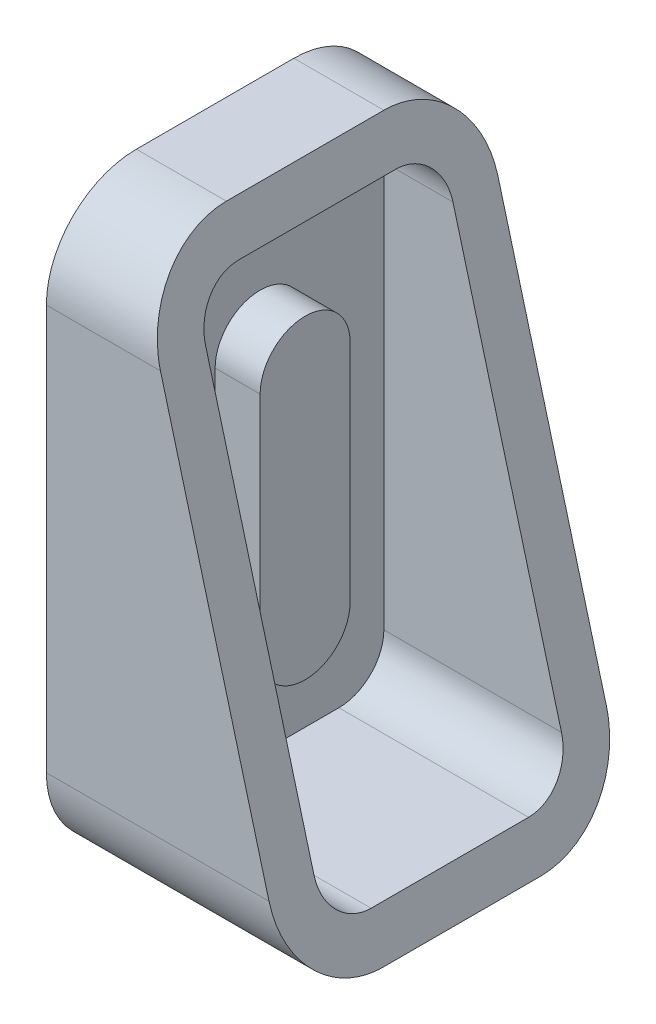
ISO-10303-21;
HEADER;
FILE_DESCRIPTION(('STEP AP214'),'2;1');
FILE_NAME('part.step','',(''),(''),'','','');
FILE_SCHEMA(('AUTOMOTIVE_DESIGN { 1 0 10303 214 1 1 1 1 }'));
ENDSEC;
DATA;
#1=APPLICATION_CONTEXT('core data for automotive mechanical design processes');
#2=APPLICATION_PROTOCOL_DEFINITION('international standard','automotive_design',2000,#1);
#3=PRODUCT_CONTEXT('',#1,'mechanical');
#4=PRODUCT('Part','Part','',(#3));
#5=PRODUCT_RELATED_PRODUCT_CATEGORY('part','',(#4));
#6=PRODUCT_DEFINITION_FORMATION('','',#4);
#7=PRODUCT_DEFINITION_CONTEXT('part definition',#1,'design');
#8=PRODUCT_DEFINITION('design','',#6,#7);
#9=PRODUCT_DEFINITION_SHAPE('','',#8);
#10=(LENGTH_UNIT() NAMED_UNIT(*) SI_UNIT(.MILLI.,.METRE.));
#11=(NAMED_UNIT(*) PLANE_ANGLE_UNIT() SI_UNIT($,.RADIAN.));
#12=(NAMED_UNIT(*) SI_UNIT($,.STERADIAN.) SOLID_ANGLE_UNIT());
#13=UNCERTAINTY_MEASURE_WITH_UNIT(LENGTH_MEASURE(1.E-05),#10,'distance_accuracy_value','');
#14=(GEOMETRIC_REPRESENTATION_CONTEXT(3) GLOBAL_UNCERTAINTY_ASSIGNED_CONTEXT((#13)) GLOBAL_UNIT_ASSIGNED_CONTEXT((#10,
#11,#12)) REPRESENTATION_CONTEXT('',''));
#15=CARTESIAN_POINT('',(0.,0.,0.));
#16=DIRECTION('',(0.,0.,1.));
#17=DIRECTION('',(1.,0.,0.));
#18=AXIS2_PLACEMENT_3D('',#15,#16,#17);
#19=CARTESIAN_POINT('',(10.,65.,37.5));
#20=DIRECTION('',(0.,0.,-1.));
#21=DIRECTION('',(0.,1.,0.));
#22=AXIS2_PLACEMENT_3D('',#19,#20,#21);
#23=PLANE('',#22);
#24=DIRECTION('',(0.,-1.,0.));
#25=VECTOR('',#24,1.);
#26=CARTESIAN_POINT('',(-10.,65.,37.5));
#27=LINE('',#26,#25);
#28=CARTESIAN_POINT('',(-10.,45.,37.5));
#29=VERTEX_POINT('',#28);
#30=CARTESIAN_POINT('',(-10.,-45.,37.5));
#31=VERTEX_POINT('',#30);
#32=EDGE_CURVE('E642',#29,#31,#27,.T.);
#33=ORIENTED_EDGE('',*,*,#32,.T.);
#34=DIRECTION('',(-1.,0.,0.));
#35=VECTOR('',#34,1.);
#36=CARTESIAN_POINT('',(10.,-45.,37.5));
#37=LINE('',#36,#35);
#38=CARTESIAN_POINT('',(39.4744111674236,-45.,37.5));
#39=VERTEX_POINT('',#38);
#40=EDGE_CURVE('E675',#31,#39,#37,.F.);
#41=ORIENTED_EDGE('',*,*,#40,.T.);
#42=DIRECTION('',(-0.258819045102521,0.965925826289068,0.));
#43=VECTOR('',#42,1.);
#44=CARTESIAN_POINT('',(10.,65.,37.5));
#45=LINE('',#44,#43);
#46=CARTESIAN_POINT('',(15.3589838486225,45.,37.5));
#47=VERTEX_POINT('',#46);
#48=EDGE_CURVE('E660',#47,#39,#45,.F.);
#49=ORIENTED_EDGE('',*,*,#48,.F.);
#50=DIRECTION('',(-1.,0.,0.));
#51=VECTOR('',#50,1.);
#52=CARTESIAN_POINT('',(10.,45.,37.5));
#53=LINE('',#52,#51);
#54=EDGE_CURVE('E672',#47,#29,#53,.T.);
#55=ORIENTED_EDGE('',*,*,#54,.T.);
#56=EDGE_LOOP('',(#33,#41,#49,#55));
#57=FACE_BOUND('',#56,.T.);
#58=ADVANCED_FACE('F419',(#57),#23,.F.);
#59=CARTESIAN_POINT('',(10.,-65.,-37.5));
#60=DIRECTION('',(0.,1.,0.));
#61=DIRECTION('',(0.,0.,1.));
#62=AXIS2_PLACEMENT_3D('',#59,#60,#61);
#63=PLANE('',#62);
#64=DIRECTION('',(0.,0.,1.));
#65=VECTOR('',#64,1.);
#66=CARTESIAN_POINT('',(44.833395016046,-65.,-37.5));
#67=LINE('',#66,#65);
#68=CARTESIAN_POINT('',(44.833395016046,-65.,17.5));
#69=VERTEX_POINT('',#68);
#70=CARTESIAN_POINT('',(44.833395016046,-65.,-17.5));
#71=VERTEX_POINT('',#70);
#72=EDGE_CURVE('E713',#69,#71,#67,.F.);
#73=ORIENTED_EDGE('',*,*,#72,.F.);
#74=DIRECTION('',(-1.,0.,0.));
#75=VECTOR('',#74,1.);
#76=CARTESIAN_POINT('',(10.,-65.,17.5));
#77=LINE('',#76,#75);
#78=CARTESIAN_POINT('',(-10.,-65.,17.5));
#79=VERTEX_POINT('',#78);
#80=EDGE_CURVE('E662',#69,#79,#77,.T.);
#81=ORIENTED_EDGE('',*,*,#80,.T.);
#82=DIRECTION('',(0.,0.,-1.));
#83=VECTOR('',#82,1.);
#84=CARTESIAN_POINT('',(-10.,-65.,-37.5));
#85=LINE('',#84,#83);
#86=CARTESIAN_POINT('',(-10.,-65.,-17.5));
#87=VERTEX_POINT('',#86);
#88=EDGE_CURVE('E652',#79,#87,#85,.T.);
#89=ORIENTED_EDGE('',*,*,#88,.T.);
#90=DIRECTION('',(-1.,0.,0.));
#91=VECTOR('',#90,1.);
#92=CARTESIAN_POINT('',(10.,-65.,-17.5));
#93=LINE('',#92,#91);
#94=EDGE_CURVE('E648',#87,#71,#93,.F.);
#95=ORIENTED_EDGE('',*,*,#94,.T.);
#96=EDGE_LOOP('',(#73,#81,#89,#95));
#97=FACE_BOUND('',#96,.T.);
#98=ADVANCED_FACE('F751',(#97),#63,.F.);
#99=CARTESIAN_POINT('',(10.,65.,-37.5));
#100=DIRECTION('',(0.,0.,1.));
#101=DIRECTION('',(0.,-1.,0.));
#102=AXIS2_PLACEMENT_3D('',#99,#100,#101);
#103=PLANE('',#102);
#104=DIRECTION('',(0.258819045102521,-0.965925826289068,0.));
#105=VECTOR('',#104,1.);
#106=CARTESIAN_POINT('',(10.,65.,-37.5));
#107=LINE('',#106,#105);
#108=CARTESIAN_POINT('',(39.4744111674236,-45.,-37.5));
#109=VERTEX_POINT('',#108);
#110=CARTESIAN_POINT('',(15.3589838486225,45.,-37.5));
#111=VERTEX_POINT('',#110);
#112=EDGE_CURVE('E649',#109,#111,#107,.F.);
#113=ORIENTED_EDGE('',*,*,#112,.F.);
#114=DIRECTION('',(-1.,0.,0.));
#115=VECTOR('',#114,1.);
#116=CARTESIAN_POINT('',(10.,-45.,-37.5));
#117=LINE('',#116,#115);
#118=CARTESIAN_POINT('',(-10.,-45.,-37.5));
#119=VERTEX_POINT('',#118);
#120=EDGE_CURVE('E681',#109,#119,#117,.T.);
#121=ORIENTED_EDGE('',*,*,#120,.T.);
#122=DIRECTION('',(0.,1.,0.));
#123=VECTOR('',#122,1.);
#124=CARTESIAN_POINT('',(-10.,65.,-37.5));
#125=LINE('',#124,#123);
#126=CARTESIAN_POINT('',(-10.,45.,-37.5));
#127=VERTEX_POINT('',#126);
#128=EDGE_CURVE('E654',#119,#127,#125,.T.);
#129=ORIENTED_EDGE('',*,*,#128,.T.);
#130=DIRECTION('',(-1.,0.,0.));
#131=VECTOR('',#130,1.);
#132=CARTESIAN_POINT('',(10.,45.,-37.5));
#133=LINE('',#132,#131);
#134=EDGE_CURVE('E679',#127,#111,#133,.F.);
#135=ORIENTED_EDGE('',*,*,#134,.T.);
#136=EDGE_LOOP('',(#113,#121,#129,#135));
#137=FACE_BOUND('',#136,.T.);
#138=ADVANCED_FACE('F729',(#137),#103,.F.);
#139=CARTESIAN_POINT('',(10.,65.,-37.5));
#140=DIRECTION('',(0.,-1.,0.));
#141=DIRECTION('',(0.,0.,-1.));
#142=AXIS2_PLACEMENT_3D('',#139,#140,#141);
#143=PLANE('',#142);
#144=DIRECTION('',(0.,0.,1.));
#145=VECTOR('',#144,1.);
#146=CARTESIAN_POINT('',(10.,65.,-37.5));
#147=LINE('',#146,#145);
#148=CARTESIAN_POINT('',(10.,65.,-17.5));
#149=VERTEX_POINT('',#148);
#150=CARTESIAN_POINT('',(10.,65.,17.5));
#151=VERTEX_POINT('',#150);
#152=EDGE_CURVE('E645',#149,#151,#147,.T.);
#153=ORIENTED_EDGE('',*,*,#152,.F.);
#154=DIRECTION('',(-1.,0.,0.));
#155=VECTOR('',#154,1.);
#156=CARTESIAN_POINT('',(10.,65.,-17.5));
#157=LINE('',#156,#155);
#158=CARTESIAN_POINT('',(-10.,65.,-17.5));
#159=VERTEX_POINT('',#158);
#160=EDGE_CURVE('E13',#149,#159,#157,.T.);
#161=ORIENTED_EDGE('',*,*,#160,.T.);
#162=DIRECTION('',(0.,0.,1.));
#163=VECTOR('',#162,1.);
#164=CARTESIAN_POINT('',(-10.,65.,-37.5));
#165=LINE('',#164,#163);
#166=CARTESIAN_POINT('',(-10.,65.,17.5));
#167=VERTEX_POINT('',#166);
#168=EDGE_CURVE('E657',#159,#167,#165,.T.);
#169=ORIENTED_EDGE('',*,*,#168,.T.);
#170=DIRECTION('',(-1.,0.,0.));
#171=VECTOR('',#170,1.);
#172=CARTESIAN_POINT('',(10.,65.,17.5));
#173=LINE('',#172,#171);
#174=EDGE_CURVE('E429',#167,#151,#173,.F.);
#175=ORIENTED_EDGE('',*,*,#174,.T.);
#176=EDGE_LOOP('',(#153,#161,#169,#175));
#177=FACE_BOUND('',#176,.T.);
#178=ADVANCED_FACE('F739',(#177),#143,.F.);
#179=CARTESIAN_POINT('',(10.,65.,-37.5));
#180=DIRECTION('',(0.965925826289068,0.258819045102521,0.));
#181=DIRECTION('',(-0.258819045102521,0.965925826289068,0.));
#182=AXIS2_PLACEMENT_3D('',#179,#180,#181);
#183=PLANE('',#182);
#184=DIRECTION('',(0.,0.,-1.));
#185=VECTOR('',#184,1.);
#186=CARTESIAN_POINT('',(42.1539030917348,-55.,17.5));
#187=LINE('',#186,#185);
#188=CARTESIAN_POINT('',(42.1539030917348,-55.,17.5));
#189=VERTEX_POINT('',#188);
#190=CARTESIAN_POINT('',(42.1539030917348,-55.,-17.5));
#191=VERTEX_POINT('',#190);
#192=EDGE_CURVE('E685',#189,#191,#187,.T.);
#193=ORIENTED_EDGE('',*,*,#192,.F.);
#194=CARTESIAN_POINT('',(39.4744111674236,-45.,17.5));
#195=DIRECTION('',(0.965925826289068,0.258819045102521,0.));
#196=DIRECTION('',(0.258819045102521,-0.965925826289068,0.));
#197=AXIS2_PLACEMENT_3D('',#194,#195,#196);
#198=ELLIPSE('',#197,10.3527618041008,10.);
#199=CARTESIAN_POINT('',(39.4744111674236,-45.,27.5));
#200=VERTEX_POINT('',#199);
#201=EDGE_CURVE('E690',#200,#189,#198,.T.);
#202=ORIENTED_EDGE('',*,*,#201,.F.);
#203=DIRECTION('',(0.258819045102521,-0.965925826289068,0.));
#204=VECTOR('',#203,1.);
#205=CARTESIAN_POINT('',(15.,46.3397459621556,27.5));
#206=LINE('',#205,#204);
#207=CARTESIAN_POINT('',(15.3589838486225,45.,27.5));
#208=VERTEX_POINT('',#207);
#209=EDGE_CURVE('E705',#208,#200,#206,.T.);
#210=ORIENTED_EDGE('',*,*,#209,.F.);
#211=CARTESIAN_POINT('',(15.3589838486225,45.,17.5));
#212=DIRECTION('',(0.965925826289068,0.258819045102521,0.));
#213=DIRECTION('',(0.258819045102521,-0.965925826289068,0.));
#214=AXIS2_PLACEMENT_3D('',#211,#212,#213);
#215=ELLIPSE('',#214,10.3527618041008,10.);
#216=CARTESIAN_POINT('',(12.6794919243112,55.,17.5));
#217=VERTEX_POINT('',#216);
#218=EDGE_CURVE('E438',#217,#208,#215,.T.);
#219=ORIENTED_EDGE('',*,*,#218,.F.);
#220=DIRECTION('',(0.,0.,1.));
#221=VECTOR('',#220,1.);
#222=CARTESIAN_POINT('',(12.6794919243112,55.,-17.5));
#223=LINE('',#222,#221);
#224=CARTESIAN_POINT('',(12.6794919243112,55.,-17.5));
#225=VERTEX_POINT('',#224);
#226=EDGE_CURVE('E644',#225,#217,#223,.T.);
#227=ORIENTED_EDGE('',*,*,#226,.F.);
#228=CARTESIAN_POINT('',(15.3589838486225,45.,-17.5));
#229=DIRECTION('',(0.965925826289068,0.258819045102521,0.));
#230=DIRECTION('',(0.258819045102521,-0.965925826289068,0.));
#231=AXIS2_PLACEMENT_3D('',#228,#229,#230);
#232=ELLIPSE('',#231,10.3527618041008,10.);
#233=CARTESIAN_POINT('',(15.3589838486225,45.,-27.5));
#234=VERTEX_POINT('',#233);
#235=EDGE_CURVE('E698',#234,#225,#232,.T.);
#236=ORIENTED_EDGE('',*,*,#235,.F.);
#237=DIRECTION('',(-0.258819045102521,0.965925826289068,0.));
#238=VECTOR('',#237,1.);
#239=CARTESIAN_POINT('',(37.5000000000001,-37.6313972081441,-27.5));
#240=LINE('',#239,#238);
#241=CARTESIAN_POINT('',(39.4744111674236,-45.,-27.5));
#242=VERTEX_POINT('',#241);
#243=EDGE_CURVE('E694',#242,#234,#240,.T.);
#244=ORIENTED_EDGE('',*,*,#243,.F.);
#245=CARTESIAN_POINT('',(39.4744111674236,-45.,-17.5));
#246=DIRECTION('',(0.965925826289068,0.258819045102521,0.));
#247=DIRECTION('',(0.258819045102521,-0.965925826289068,0.));
#248=AXIS2_PLACEMENT_3D('',#245,#246,#247);
#249=ELLIPSE('',#248,10.3527618041008,10.);
#250=EDGE_CURVE('E689',#191,#242,#249,.T.);
#251=ORIENTED_EDGE('',*,*,#250,.F.);
#252=EDGE_LOOP('',(#193,#202,#210,#219,#227,#236,#244,#251));
#253=FACE_BOUND('',#252,.T.);
#254=ORIENTED_EDGE('',*,*,#48,.T.);
#255=CARTESIAN_POINT('',(39.4744111674236,-45.,17.5));
#256=DIRECTION('',(0.965925826289068,0.258819045102521,0.));
#257=DIRECTION('',(-0.258819045102521,0.965925826289068,0.));
#258=AXIS2_PLACEMENT_3D('',#255,#256,#257);
#259=ELLIPSE('',#258,20.7055236082017,20.);
#260=EDGE_CURVE('E423',#39,#69,#259,.T.);
#261=ORIENTED_EDGE('',*,*,#260,.T.);
#262=ORIENTED_EDGE('',*,*,#72,.T.);
#263=CARTESIAN_POINT('',(39.4744111674236,-45.,-17.5));
#264=DIRECTION('',(0.965925826289068,0.258819045102521,0.));
#265=DIRECTION('',(-0.258819045102521,0.965925826289068,0.));
#266=AXIS2_PLACEMENT_3D('',#263,#264,#265);
#267=ELLIPSE('',#266,20.7055236082017,20.);
#268=EDGE_CURVE('E717',#71,#109,#267,.T.);
#269=ORIENTED_EDGE('',*,*,#268,.T.);
#270=ORIENTED_EDGE('',*,*,#112,.T.);
#271=CARTESIAN_POINT('',(15.3589838486225,45.,-17.5));
#272=DIRECTION('',(0.965925826289068,0.258819045102521,0.));
#273=DIRECTION('',(-0.258819045102521,0.965925826289068,0.));
#274=AXIS2_PLACEMENT_3D('',#271,#272,#273);
#275=ELLIPSE('',#274,20.7055236082017,20.);
#276=EDGE_CURVE('E715',#111,#149,#275,.T.);
#277=ORIENTED_EDGE('',*,*,#276,.T.);
#278=ORIENTED_EDGE('',*,*,#152,.T.);
#279=CARTESIAN_POINT('',(15.3589838486225,45.,17.5));
#280=DIRECTION('',(0.965925826289068,0.258819045102521,0.));
#281=DIRECTION('',(-0.258819045102521,0.965925826289068,0.));
#282=AXIS2_PLACEMENT_3D('',#279,#280,#281);
#283=ELLIPSE('',#282,20.7055236082017,20.);
#284=EDGE_CURVE('E678',#151,#47,#283,.T.);
#285=ORIENTED_EDGE('',*,*,#284,.T.);
#286=EDGE_LOOP('',(#254,#261,#262,#269,#270,#277,#278,#285));
#287=FACE_BOUND('',#286,.T.);
#288=ADVANCED_FACE('F421',(#253,#287),#183,.T.);
#289=CARTESIAN_POINT('',(-10.,0.,0.));
#290=DIRECTION('',(-1.,0.,0.));
#291=DIRECTION('',(0.,0.,1.));
#292=AXIS2_PLACEMENT_3D('',#289,#290,#291);
#293=PLANE('',#292);
#294=ORIENTED_EDGE('',*,*,#88,.F.);
#295=CARTESIAN_POINT('',(-10.,-45.,17.5));
#296=DIRECTION('',(-1.,0.,0.));
#297=DIRECTION('',(0.,0.,1.));
#298=AXIS2_PLACEMENT_3D('',#295,#296,#297);
#299=CIRCLE('',#298,20.);
#300=EDGE_CURVE('E670',#79,#31,#299,.T.);
#301=ORIENTED_EDGE('',*,*,#300,.T.);
#302=ORIENTED_EDGE('',*,*,#32,.F.);
#303=CARTESIAN_POINT('',(-10.,45.,17.5));
#304=DIRECTION('',(-1.,0.,0.));
#305=DIRECTION('',(0.,0.,1.));
#306=AXIS2_PLACEMENT_3D('',#303,#304,#305);
#307=CIRCLE('',#306,20.);
#308=EDGE_CURVE('E665',#29,#167,#307,.T.);
#309=ORIENTED_EDGE('',*,*,#308,.T.);
#310=ORIENTED_EDGE('',*,*,#168,.F.);
#311=CARTESIAN_POINT('',(-10.,45.,-17.5));
#312=DIRECTION('',(-1.,0.,0.));
#313=DIRECTION('',(0.,0.,1.));
#314=AXIS2_PLACEMENT_3D('',#311,#312,#313);
#315=CIRCLE('',#314,20.);
#316=EDGE_CURVE('E667',#159,#127,#315,.T.);
#317=ORIENTED_EDGE('',*,*,#316,.T.);
#318=ORIENTED_EDGE('',*,*,#128,.F.);
#319=CARTESIAN_POINT('',(-10.,-45.,-17.5));
#320=DIRECTION('',(-1.,0.,0.));
#321=DIRECTION('',(0.,0.,1.));
#322=AXIS2_PLACEMENT_3D('',#319,#320,#321);
#323=CIRCLE('',#322,20.);
#324=EDGE_CURVE('E484',#119,#87,#323,.T.);
#325=ORIENTED_EDGE('',*,*,#324,.T.);
#326=EDGE_LOOP('',(#294,#301,#302,#309,#310,#317,#318,#325));
#327=FACE_BOUND('',#326,.T.);
#328=ADVANCED_FACE('F731',(#327),#293,.T.);
#329=CARTESIAN_POINT('',(10.,-45.,17.5));
#330=DIRECTION('',(-1.,0.,0.));
#331=DIRECTION('',(0.,0.,1.));
#332=AXIS2_PLACEMENT_3D('',#329,#330,#331);
#333=CYLINDRICAL_SURFACE('',#332,20.);
#334=ORIENTED_EDGE('',*,*,#260,.F.);
#335=ORIENTED_EDGE('',*,*,#40,.F.);
#336=ORIENTED_EDGE('',*,*,#300,.F.);
#337=ORIENTED_EDGE('',*,*,#80,.F.);
#338=EDGE_LOOP('',(#334,#335,#336,#337));
#339=FACE_BOUND('',#338,.T.);
#340=ADVANCED_FACE('F750',(#339),#333,.T.);
#341=CARTESIAN_POINT('',(10.,-45.,-17.5));
#342=DIRECTION('',(-1.,0.,0.));
#343=DIRECTION('',(0.,0.,1.));
#344=AXIS2_PLACEMENT_3D('',#341,#342,#343);
#345=CYLINDRICAL_SURFACE('',#344,20.);
#346=ORIENTED_EDGE('',*,*,#268,.F.);
#347=ORIENTED_EDGE('',*,*,#94,.F.);
#348=ORIENTED_EDGE('',*,*,#324,.F.);
#349=ORIENTED_EDGE('',*,*,#120,.F.);
#350=EDGE_LOOP('',(#346,#347,#348,#349));
#351=FACE_BOUND('',#350,.T.);
#352=ADVANCED_FACE('F727',(#351),#345,.T.);
#353=CARTESIAN_POINT('',(10.,45.,-17.5));
#354=DIRECTION('',(-1.,0.,0.));
#355=DIRECTION('',(0.,0.,1.));
#356=AXIS2_PLACEMENT_3D('',#353,#354,#355);
#357=CYLINDRICAL_SURFACE('',#356,20.);
#358=ORIENTED_EDGE('',*,*,#276,.F.);
#359=ORIENTED_EDGE('',*,*,#134,.F.);
#360=ORIENTED_EDGE('',*,*,#316,.F.);
#361=ORIENTED_EDGE('',*,*,#160,.F.);
#362=EDGE_LOOP('',(#358,#359,#360,#361));
#363=FACE_BOUND('',#362,.T.);
#364=ADVANCED_FACE('F736',(#363),#357,.T.);
#365=CARTESIAN_POINT('',(10.,45.,17.5));
#366=DIRECTION('',(-1.,0.,0.));
#367=DIRECTION('',(0.,0.,1.));
#368=AXIS2_PLACEMENT_3D('',#365,#366,#367);
#369=CYLINDRICAL_SURFACE('',#368,20.);
#370=ORIENTED_EDGE('',*,*,#284,.F.);
#371=ORIENTED_EDGE('',*,*,#174,.F.);
#372=ORIENTED_EDGE('',*,*,#308,.F.);
#373=ORIENTED_EDGE('',*,*,#54,.F.);
#374=EDGE_LOOP('',(#370,#371,#372,#373));
#375=FACE_BOUND('',#374,.T.);
#376=ADVANCED_FACE('F745',(#375),#369,.T.);
#377=CARTESIAN_POINT('',(10.,-45.,17.5));
#378=DIRECTION('',(1.,0.,0.));
#379=DIRECTION('',(0.,0.,-1.));
#380=AXIS2_PLACEMENT_3D('',#377,#378,#379);
#381=CYLINDRICAL_SURFACE('',#380,10.);
#382=DIRECTION('',(1.,0.,0.));
#383=VECTOR('',#382,1.);
#384=CARTESIAN_POINT('',(10.,-45.,27.5));
#385=LINE('',#384,#383);
#386=CARTESIAN_POINT('',(0.,-45.,27.5));
#387=VERTEX_POINT('',#386);
#388=EDGE_CURVE('E640',#387,#200,#385,.T.);
#389=ORIENTED_EDGE('',*,*,#388,.T.);
#390=ORIENTED_EDGE('',*,*,#201,.T.);
#391=DIRECTION('',(1.,0.,0.));
#392=VECTOR('',#391,1.);
#393=CARTESIAN_POINT('',(10.,-55.,17.5));
#394=LINE('',#393,#392);
#395=CARTESIAN_POINT('',(0.,-55.,17.5));
#396=VERTEX_POINT('',#395);
#397=EDGE_CURVE('E638',#396,#189,#394,.T.);
#398=ORIENTED_EDGE('',*,*,#397,.F.);
#399=CARTESIAN_POINT('',(0.,-45.,17.5));
#400=DIRECTION('',(1.,0.,0.));
#401=DIRECTION('',(0.,0.,-1.));
#402=AXIS2_PLACEMENT_3D('',#399,#400,#401);
#403=CIRCLE('',#402,10.);
#404=EDGE_CURVE('E622',#387,#396,#403,.T.);
#405=ORIENTED_EDGE('',*,*,#404,.F.);
#406=EDGE_LOOP('',(#389,#390,#398,#405));
#407=FACE_BOUND('',#406,.T.);
#408=ADVANCED_FACE('F768',(#407),#381,.F.);
#409=CARTESIAN_POINT('',(10.,-55.,17.5));
#410=DIRECTION('',(0.,1.,0.));
#411=DIRECTION('',(0.,0.,-1.));
#412=AXIS2_PLACEMENT_3D('',#409,#410,#411);
#413=PLANE('',#412);
#414=ORIENTED_EDGE('',*,*,#397,.T.);
#415=ORIENTED_EDGE('',*,*,#192,.T.);
#416=DIRECTION('',(1.,0.,0.));
#417=VECTOR('',#416,1.);
#418=CARTESIAN_POINT('',(10.,-55.,-17.5));
#419=LINE('',#418,#417);
#420=CARTESIAN_POINT('',(0.,-55.,-17.5));
#421=VERTEX_POINT('',#420);
#422=EDGE_CURVE('E636',#421,#191,#419,.T.);
#423=ORIENTED_EDGE('',*,*,#422,.F.);
#424=DIRECTION('',(0.,0.,1.));
#425=VECTOR('',#424,1.);
#426=CARTESIAN_POINT('',(0.,-55.,0.));
#427=LINE('',#426,#425);
#428=EDGE_CURVE('E618',#396,#421,#427,.F.);
#429=ORIENTED_EDGE('',*,*,#428,.F.);
#430=EDGE_LOOP('',(#414,#415,#423,#429));
#431=FACE_BOUND('',#430,.T.);
#432=ADVANCED_FACE('F772',(#431),#413,.T.);
#433=CARTESIAN_POINT('',(10.,-45.,-17.5));
#434=DIRECTION('',(1.,0.,0.));
#435=DIRECTION('',(0.,0.,-1.));
#436=AXIS2_PLACEMENT_3D('',#433,#434,#435);
#437=CYLINDRICAL_SURFACE('',#436,10.);
#438=ORIENTED_EDGE('',*,*,#422,.T.);
#439=ORIENTED_EDGE('',*,*,#250,.T.);
#440=DIRECTION('',(1.,0.,0.));
#441=VECTOR('',#440,1.);
#442=CARTESIAN_POINT('',(10.,-45.,-27.5));
#443=LINE('',#442,#441);
#444=CARTESIAN_POINT('',(0.,-45.,-27.5));
#445=VERTEX_POINT('',#444);
#446=EDGE_CURVE('E634',#445,#242,#443,.T.);
#447=ORIENTED_EDGE('',*,*,#446,.F.);
#448=CARTESIAN_POINT('',(0.,-45.,-17.5));
#449=DIRECTION('',(1.,0.,0.));
#450=DIRECTION('',(0.,0.,-1.));
#451=AXIS2_PLACEMENT_3D('',#448,#449,#450);
#452=CIRCLE('',#451,10.);
#453=EDGE_CURVE('E614',#421,#445,#452,.T.);
#454=ORIENTED_EDGE('',*,*,#453,.F.);
#455=EDGE_LOOP('',(#438,#439,#447,#454));
#456=FACE_BOUND('',#455,.T.);
#457=ADVANCED_FACE('F778',(#456),#437,.F.);
#458=CARTESIAN_POINT('',(10.,-45.,-27.5));
#459=DIRECTION('',(0.,0.,1.));
#460=DIRECTION('',(0.,1.,0.));
#461=AXIS2_PLACEMENT_3D('',#458,#459,#460);
#462=PLANE('',#461);
#463=ORIENTED_EDGE('',*,*,#446,.T.);
#464=ORIENTED_EDGE('',*,*,#243,.T.);
#465=DIRECTION('',(1.,0.,0.));
#466=VECTOR('',#465,1.);
#467=CARTESIAN_POINT('',(10.,45.,-27.5));
#468=LINE('',#467,#466);
#469=CARTESIAN_POINT('',(0.,45.,-27.5));
#470=VERTEX_POINT('',#469);
#471=EDGE_CURVE('E632',#470,#234,#468,.T.);
#472=ORIENTED_EDGE('',*,*,#471,.F.);
#473=DIRECTION('',(0.,1.,0.));
#474=VECTOR('',#473,1.);
#475=CARTESIAN_POINT('',(0.,0.,-27.5));
#476=LINE('',#475,#474);
#477=EDGE_CURVE('E610',#445,#470,#476,.T.);
#478=ORIENTED_EDGE('',*,*,#477,.F.);
#479=EDGE_LOOP('',(#463,#464,#472,#478));
#480=FACE_BOUND('',#479,.T.);
#481=ADVANCED_FACE('F901',(#480),#462,.T.);
#482=CARTESIAN_POINT('',(10.,45.,-17.5));
#483=DIRECTION('',(1.,0.,0.));
#484=DIRECTION('',(0.,0.,-1.));
#485=AXIS2_PLACEMENT_3D('',#482,#483,#484);
#486=CYLINDRICAL_SURFACE('',#485,10.);
#487=ORIENTED_EDGE('',*,*,#471,.T.);
#488=ORIENTED_EDGE('',*,*,#235,.T.);
#489=DIRECTION('',(1.,0.,0.));
#490=VECTOR('',#489,1.);
#491=CARTESIAN_POINT('',(10.,55.,-17.5));
#492=LINE('',#491,#490);
#493=CARTESIAN_POINT('',(0.,55.,-17.5));
#494=VERTEX_POINT('',#493);
#495=EDGE_CURVE('E524',#494,#225,#492,.T.);
#496=ORIENTED_EDGE('',*,*,#495,.F.);
#497=CARTESIAN_POINT('',(0.,45.,-17.5));
#498=DIRECTION('',(1.,0.,0.));
#499=DIRECTION('',(0.,0.,-1.));
#500=AXIS2_PLACEMENT_3D('',#497,#498,#499);
#501=CIRCLE('',#500,10.);
#502=EDGE_CURVE('E606',#470,#494,#501,.T.);
#503=ORIENTED_EDGE('',*,*,#502,.F.);
#504=EDGE_LOOP('',(#487,#488,#496,#503));
#505=FACE_BOUND('',#504,.T.);
#506=ADVANCED_FACE('F823',(#505),#486,.F.);
#507=CARTESIAN_POINT('',(10.,55.,-17.5));
#508=DIRECTION('',(0.,-1.,0.));
#509=DIRECTION('',(0.,0.,1.));
#510=AXIS2_PLACEMENT_3D('',#507,#508,#509);
#511=PLANE('',#510);
#512=ORIENTED_EDGE('',*,*,#495,.T.);
#513=ORIENTED_EDGE('',*,*,#226,.T.);
#514=DIRECTION('',(1.,0.,0.));
#515=VECTOR('',#514,1.);
#516=CARTESIAN_POINT('',(10.,55.,17.5));
#517=LINE('',#516,#515);
#518=CARTESIAN_POINT('',(0.,55.,17.5));
#519=VERTEX_POINT('',#518);
#520=EDGE_CURVE('E629',#519,#217,#517,.T.);
#521=ORIENTED_EDGE('',*,*,#520,.F.);
#522=DIRECTION('',(0.,0.,1.));
#523=VECTOR('',#522,1.);
#524=CARTESIAN_POINT('',(0.,55.,0.));
#525=LINE('',#524,#523);
#526=EDGE_CURVE('E602',#494,#519,#525,.T.);
#527=ORIENTED_EDGE('',*,*,#526,.F.);
#528=EDGE_LOOP('',(#512,#513,#521,#527));
#529=FACE_BOUND('',#528,.T.);
#530=ADVANCED_FACE('F813',(#529),#511,.T.);
#531=CARTESIAN_POINT('',(10.,45.,17.5));
#532=DIRECTION('',(1.,0.,0.));
#533=DIRECTION('',(0.,0.,-1.));
#534=AXIS2_PLACEMENT_3D('',#531,#532,#533);
#535=CYLINDRICAL_SURFACE('',#534,10.);
#536=ORIENTED_EDGE('',*,*,#520,.T.);
#537=ORIENTED_EDGE('',*,*,#218,.T.);
#538=DIRECTION('',(1.,0.,0.));
#539=VECTOR('',#538,1.);
#540=CARTESIAN_POINT('',(10.,45.,27.5));
#541=LINE('',#540,#539);
#542=CARTESIAN_POINT('',(0.,45.,27.5));
#543=VERTEX_POINT('',#542);
#544=EDGE_CURVE('E529',#543,#208,#541,.T.);
#545=ORIENTED_EDGE('',*,*,#544,.F.);
#546=CARTESIAN_POINT('',(0.,45.,17.5));
#547=DIRECTION('',(1.,0.,0.));
#548=DIRECTION('',(0.,0.,-1.));
#549=AXIS2_PLACEMENT_3D('',#546,#547,#548);
#550=CIRCLE('',#549,10.);
#551=EDGE_CURVE('E596',#519,#543,#550,.T.);
#552=ORIENTED_EDGE('',*,*,#551,.F.);
#553=EDGE_LOOP('',(#536,#537,#545,#552));
#554=FACE_BOUND('',#553,.T.);
#555=ADVANCED_FACE('F787',(#554),#535,.F.);
#556=CARTESIAN_POINT('',(10.,45.,27.5));
#557=DIRECTION('',(0.,0.,-1.));
#558=DIRECTION('',(0.,-1.,0.));
#559=AXIS2_PLACEMENT_3D('',#556,#557,#558);
#560=PLANE('',#559);
#561=DIRECTION('',(0.,1.,0.));
#562=VECTOR('',#561,1.);
#563=CARTESIAN_POINT('',(0.,0.,27.5));
#564=LINE('',#563,#562);
#565=EDGE_CURVE('E601',#543,#387,#564,.F.);
#566=ORIENTED_EDGE('',*,*,#565,.F.);
#567=ORIENTED_EDGE('',*,*,#544,.T.);
#568=ORIENTED_EDGE('',*,*,#209,.T.);
#569=ORIENTED_EDGE('',*,*,#388,.F.);
#570=EDGE_LOOP('',(#566,#567,#568,#569));
#571=FACE_BOUND('',#570,.T.);
#572=ADVANCED_FACE('F783',(#571),#560,.T.);
#573=CARTESIAN_POINT('',(0.,0.,0.));
#574=DIRECTION('',(-1.,0.,0.));
#575=DIRECTION('',(0.,0.,1.));
#576=AXIS2_PLACEMENT_3D('',#573,#574,#575);
#577=PLANE('',#576);
#578=CARTESIAN_POINT('',(0.,-25.8717132087389,0.));
#579=DIRECTION('',(1.,0.,0.));
#580=DIRECTION('',(0.,0.,-1.));
#581=AXIS2_PLACEMENT_3D('',#578,#579,#580);
#582=CIRCLE('',#581,10.);
#583=CARTESIAN_POINT('',(0.,-25.8717132087389,9.99999999999999));
#584=VERTEX_POINT('',#583);
#585=CARTESIAN_POINT('',(0.,-25.8717132087389,-10.));
#586=VERTEX_POINT('',#585);
#587=EDGE_CURVE('E579',#584,#586,#582,.T.);
#588=ORIENTED_EDGE('',*,*,#587,.F.);
#589=DIRECTION('',(0.,1.,0.));
#590=VECTOR('',#589,1.);
#591=CARTESIAN_POINT('',(0.,0.,10.));
#592=LINE('',#591,#590);
#593=CARTESIAN_POINT('',(0.,24.1282867912611,10.));
#594=VERTEX_POINT('',#593);
#595=EDGE_CURVE('E584',#594,#584,#592,.F.);
#596=ORIENTED_EDGE('',*,*,#595,.F.);
#597=CARTESIAN_POINT('',(0.,24.1282867912611,0.));
#598=DIRECTION('',(1.,0.,0.));
#599=DIRECTION('',(0.,0.,-1.));
#600=AXIS2_PLACEMENT_3D('',#597,#598,#599);
#601=CIRCLE('',#600,10.);
#602=CARTESIAN_POINT('',(0.,24.1282867912611,-10.));
#603=VERTEX_POINT('',#602);
#604=EDGE_CURVE('E552',#603,#594,#601,.T.);
#605=ORIENTED_EDGE('',*,*,#604,.F.);
#606=DIRECTION('',(0.,1.,0.));
#607=VECTOR('',#606,1.);
#608=CARTESIAN_POINT('',(0.,0.,-10.));
#609=LINE('',#608,#607);
#610=EDGE_CURVE('E573',#586,#603,#609,.T.);
#611=ORIENTED_EDGE('',*,*,#610,.F.);
#612=EDGE_LOOP('',(#588,#596,#605,#611));
#613=FACE_BOUND('',#612,.T.);
#614=ORIENTED_EDGE('',*,*,#551,.T.);
#615=ORIENTED_EDGE('',*,*,#565,.T.);
#616=ORIENTED_EDGE('',*,*,#404,.T.);
#617=ORIENTED_EDGE('',*,*,#428,.T.);
#618=ORIENTED_EDGE('',*,*,#453,.T.);
#619=ORIENTED_EDGE('',*,*,#477,.T.);
#620=ORIENTED_EDGE('',*,*,#502,.T.);
#621=ORIENTED_EDGE('',*,*,#526,.T.);
#622=EDGE_LOOP('',(#614,#615,#616,#617,#618,#619,#620,#621));
#623=FACE_BOUND('',#622,.T.);
#624=ADVANCED_FACE('F786',(#613,#623),#577,.F.);
#625=CARTESIAN_POINT('',(10.,-25.8717132087389,0.));
#626=DIRECTION('',(1.,0.,0.));
#627=DIRECTION('',(0.,0.,-1.));
#628=AXIS2_PLACEMENT_3D('',#625,#626,#627);
#629=CYLINDRICAL_SURFACE('',#628,10.);
#630=DIRECTION('',(1.,0.,0.));
#631=VECTOR('',#630,1.);
#632=CARTESIAN_POINT('',(10.,-25.8717132087389,10.));
#633=LINE('',#632,#631);
#634=CARTESIAN_POINT('',(10.,-25.8717132087389,9.99999999999999));
#635=VERTEX_POINT('',#634);
#636=EDGE_CURVE('E564',#584,#635,#633,.T.);
#637=ORIENTED_EDGE('',*,*,#636,.F.);
#638=ORIENTED_EDGE('',*,*,#587,.T.);
#639=DIRECTION('',(1.,0.,0.));
#640=VECTOR('',#639,1.);
#641=CARTESIAN_POINT('',(10.,-25.8717132087389,-10.));
#642=LINE('',#641,#640);
#643=CARTESIAN_POINT('',(10.,-25.8717132087389,-10.));
#644=VERTEX_POINT('',#643);
#645=EDGE_CURVE('E593',#586,#644,#642,.T.);
#646=ORIENTED_EDGE('',*,*,#645,.T.);
#647=CARTESIAN_POINT('',(10.,-25.8717132087389,0.));
#648=DIRECTION('',(1.,0.,0.));
#649=DIRECTION('',(0.,0.,1.));
#650=AXIS2_PLACEMENT_3D('',#647,#648,#649);
#651=CIRCLE('',#650,10.);
#652=EDGE_CURVE('E568',#635,#644,#651,.T.);
#653=ORIENTED_EDGE('',*,*,#652,.F.);
#654=EDGE_LOOP('',(#637,#638,#646,#653));
#655=FACE_BOUND('',#654,.T.);
#656=ADVANCED_FACE('F841',(#655),#629,.T.);
#657=CARTESIAN_POINT('',(10.,24.1282867912611,-10.));
#658=DIRECTION('',(0.,0.,1.));
#659=DIRECTION('',(0.,1.,0.));
#660=AXIS2_PLACEMENT_3D('',#657,#658,#659);
#661=PLANE('',#660);
#662=ORIENTED_EDGE('',*,*,#645,.F.);
#663=ORIENTED_EDGE('',*,*,#610,.T.);
#664=DIRECTION('',(1.,0.,0.));
#665=VECTOR('',#664,1.);
#666=CARTESIAN_POINT('',(10.,24.1282867912611,-10.));
#667=LINE('',#666,#665);
#668=CARTESIAN_POINT('',(10.,24.1282867912611,-10.));
#669=VERTEX_POINT('',#668);
#670=EDGE_CURVE('E556',#603,#669,#667,.T.);
#671=ORIENTED_EDGE('',*,*,#670,.T.);
#672=DIRECTION('',(0.,1.,0.));
#673=VECTOR('',#672,1.);
#674=CARTESIAN_POINT('',(10.,24.1282867912611,-10.));
#675=LINE('',#674,#673);
#676=EDGE_CURVE('E557',#644,#669,#675,.T.);
#677=ORIENTED_EDGE('',*,*,#676,.F.);
#678=EDGE_LOOP('',(#662,#663,#671,#677));
#679=FACE_BOUND('',#678,.T.);
#680=ADVANCED_FACE('F844',(#679),#661,.F.);
#681=CARTESIAN_POINT('',(10.,24.1282867912611,0.));
#682=DIRECTION('',(1.,0.,0.));
#683=DIRECTION('',(0.,0.,-1.));
#684=AXIS2_PLACEMENT_3D('',#681,#682,#683);
#685=CYLINDRICAL_SURFACE('',#684,10.);
#686=ORIENTED_EDGE('',*,*,#670,.F.);
#687=ORIENTED_EDGE('',*,*,#604,.T.);
#688=DIRECTION('',(1.,0.,0.));
#689=VECTOR('',#688,1.);
#690=CARTESIAN_POINT('',(10.,24.1282867912611,10.));
#691=LINE('',#690,#689);
#692=CARTESIAN_POINT('',(10.,24.1282867912611,10.));
#693=VERTEX_POINT('',#692);
#694=EDGE_CURVE('E542',#594,#693,#691,.T.);
#695=ORIENTED_EDGE('',*,*,#694,.T.);
#696=CARTESIAN_POINT('',(10.,24.1282867912611,0.));
#697=DIRECTION('',(1.,0.,0.));
#698=DIRECTION('',(0.,0.,1.));
#699=AXIS2_PLACEMENT_3D('',#696,#697,#698);
#700=CIRCLE('',#699,10.);
#701=EDGE_CURVE('E548',#669,#693,#700,.T.);
#702=ORIENTED_EDGE('',*,*,#701,.F.);
#703=EDGE_LOOP('',(#686,#687,#695,#702));
#704=FACE_BOUND('',#703,.T.);
#705=ADVANCED_FACE('F545',(#704),#685,.T.);
#706=CARTESIAN_POINT('',(10.,24.1282867912611,10.));
#707=DIRECTION('',(0.,0.,-1.));
#708=DIRECTION('',(0.,-1.,0.));
#709=AXIS2_PLACEMENT_3D('',#706,#707,#708);
#710=PLANE('',#709);
#711=ORIENTED_EDGE('',*,*,#595,.T.);
#712=ORIENTED_EDGE('',*,*,#636,.T.);
#713=DIRECTION('',(0.,-1.,0.));
#714=VECTOR('',#713,1.);
#715=CARTESIAN_POINT('',(10.,24.1282867912611,10.));
#716=LINE('',#715,#714);
#717=EDGE_CURVE('E561',#693,#635,#716,.T.);
#718=ORIENTED_EDGE('',*,*,#717,.F.);
#719=ORIENTED_EDGE('',*,*,#694,.F.);
#720=EDGE_LOOP('',(#711,#712,#718,#719));
#721=FACE_BOUND('',#720,.T.);
#722=ADVANCED_FACE('F562',(#721),#710,.F.);
#723=CARTESIAN_POINT('',(10.,0.,0.));
#724=DIRECTION('',(-1.,0.,0.));
#725=DIRECTION('',(0.,0.,1.));
#726=AXIS2_PLACEMENT_3D('',#723,#724,#725);
#727=PLANE('',#726);
#728=ORIENTED_EDGE('',*,*,#652,.T.);
#729=ORIENTED_EDGE('',*,*,#676,.T.);
#730=ORIENTED_EDGE('',*,*,#701,.T.);
#731=ORIENTED_EDGE('',*,*,#717,.T.);
#732=EDGE_LOOP('',(#728,#729,#730,#731));
#733=FACE_BOUND('',#732,.T.);
#734=ADVANCED_FACE('F570',(#733),#727,.F.);
#735=CLOSED_SHELL('',(#58,#98,#138,#178,#288,#328,#340,#352,#364,#376,#408,#432,#457,#481,#506,
#530,#555,#572,#624,#656,#680,#705,#722,#734));
#736=MANIFOLD_SOLID_BREP('B2',#735);
#737=ADVANCED_BREP_SHAPE_REPRESENTATION('',(#18,#736),#14);
#738=SHAPE_DEFINITION_REPRESENTATION(#9,#737);
ENDSEC;
END-ISO-10303-21;
